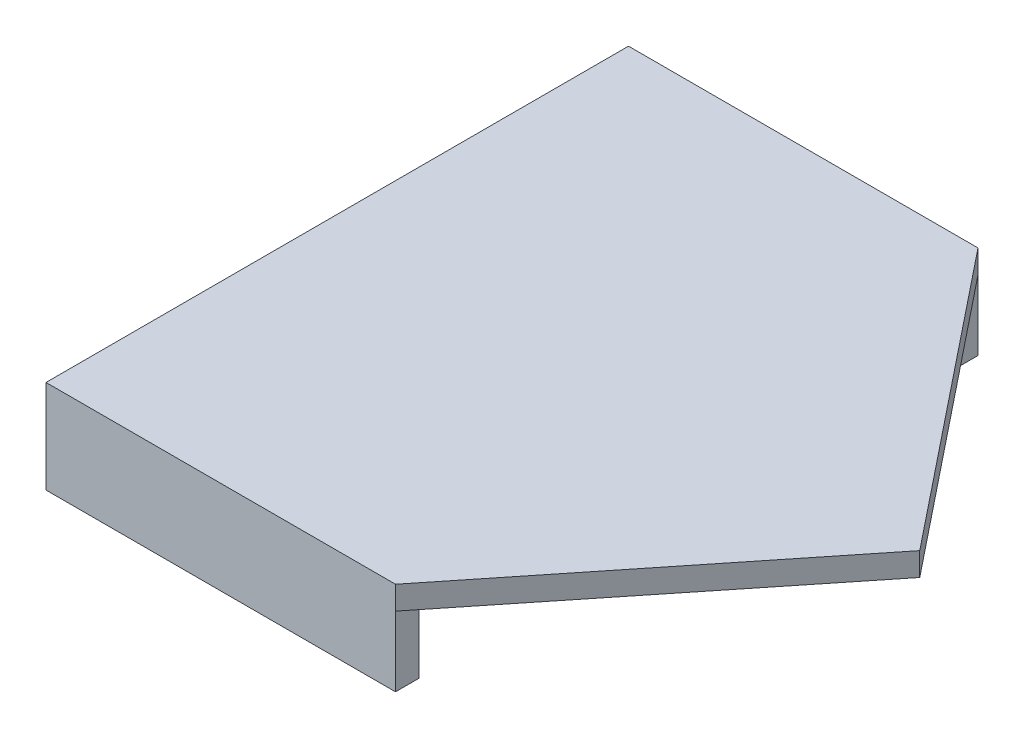
ISO-10303-21;
HEADER;
FILE_DESCRIPTION(('STEP AP214'),'2;1');
FILE_NAME('part.step','',(''),(''),'','','');
FILE_SCHEMA(('AUTOMOTIVE_DESIGN { 1 0 10303 214 1 1 1 1 }'));
ENDSEC;
DATA;
#1=APPLICATION_CONTEXT('core data for automotive mechanical design processes');
#2=APPLICATION_PROTOCOL_DEFINITION('international standard','automotive_design',2000,#1);
#3=PRODUCT_CONTEXT('',#1,'mechanical');
#4=PRODUCT('Part','Part','',(#3));
#5=PRODUCT_RELATED_PRODUCT_CATEGORY('part','',(#4));
#6=PRODUCT_DEFINITION_FORMATION('','',#4);
#7=PRODUCT_DEFINITION_CONTEXT('part definition',#1,'design');
#8=PRODUCT_DEFINITION('design','',#6,#7);
#9=PRODUCT_DEFINITION_SHAPE('','',#8);
#10=(LENGTH_UNIT() NAMED_UNIT(*) SI_UNIT(.MILLI.,.METRE.));
#11=(NAMED_UNIT(*) PLANE_ANGLE_UNIT() SI_UNIT($,.RADIAN.));
#12=(NAMED_UNIT(*) SI_UNIT($,.STERADIAN.) SOLID_ANGLE_UNIT());
#13=UNCERTAINTY_MEASURE_WITH_UNIT(LENGTH_MEASURE(1.E-05),#10,'distance_accuracy_value','');
#14=(GEOMETRIC_REPRESENTATION_CONTEXT(3) GLOBAL_UNCERTAINTY_ASSIGNED_CONTEXT((#13)) GLOBAL_UNIT_ASSIGNED_CONTEXT((#10,
#11,#12)) REPRESENTATION_CONTEXT('',''));
#15=CARTESIAN_POINT('',(0.,0.,0.));
#16=DIRECTION('',(0.,0.,1.));
#17=DIRECTION('',(1.,0.,0.));
#18=AXIS2_PLACEMENT_3D('',#15,#16,#17);
#19=CARTESIAN_POINT('',(0.,-5.,0.));
#20=DIRECTION('',(0.,1.,0.));
#21=DIRECTION('',(0.,0.,1.));
#22=AXIS2_PLACEMENT_3D('',#19,#20,#21);
#23=PLANE('',#22);
#24=DIRECTION('',(0.,0.,1.));
#25=VECTOR('',#24,1.);
#26=CARTESIAN_POINT('',(75.,-5.,115.));
#27=LINE('',#26,#25);
#28=CARTESIAN_POINT('',(75.,-5.,115.));
#29=VERTEX_POINT('',#28);
#30=CARTESIAN_POINT('',(75.,-5.,125.));
#31=VERTEX_POINT('',#30);
#32=EDGE_CURVE('E142',#29,#31,#27,.T.);
#33=ORIENTED_EDGE('',*,*,#32,.F.);
#34=DIRECTION('',(1.,0.,0.));
#35=VECTOR('',#34,1.);
#36=CARTESIAN_POINT('',(75.,-5.,115.));
#37=LINE('',#36,#35);
#38=CARTESIAN_POINT('',(-75.,-5.,115.));
#39=VERTEX_POINT('',#38);
#40=EDGE_CURVE('E212',#39,#29,#37,.T.);
#41=ORIENTED_EDGE('',*,*,#40,.F.);
#42=DIRECTION('',(0.,0.,1.));
#43=VECTOR('',#42,1.);
#44=CARTESIAN_POINT('',(-75.,-5.,125.));
#45=LINE('',#44,#43);
#46=CARTESIAN_POINT('',(-75.,-5.,-115.));
#47=VERTEX_POINT('',#46);
#48=EDGE_CURVE('E110',#47,#39,#45,.T.);
#49=ORIENTED_EDGE('',*,*,#48,.F.);
#50=DIRECTION('',(1.,0.,0.));
#51=VECTOR('',#50,1.);
#52=CARTESIAN_POINT('',(75.,-5.,-115.));
#53=LINE('',#52,#51);
#54=CARTESIAN_POINT('',(75.,-5.,-115.));
#55=VERTEX_POINT('',#54);
#56=EDGE_CURVE('E158',#47,#55,#53,.T.);
#57=ORIENTED_EDGE('',*,*,#56,.T.);
#58=DIRECTION('',(0.,0.,-1.));
#59=VECTOR('',#58,1.);
#60=CARTESIAN_POINT('',(75.,-5.,-115.));
#61=LINE('',#60,#59);
#62=CARTESIAN_POINT('',(75.,-5.,-125.));
#63=VERTEX_POINT('',#62);
#64=EDGE_CURVE('E113',#55,#63,#61,.T.);
#65=ORIENTED_EDGE('',*,*,#64,.T.);
#66=DIRECTION('',(-0.624695047554424,0.,-0.78086880944303));
#67=VECTOR('',#66,1.);
#68=CARTESIAN_POINT('',(75.,-5.,-125.));
#69=LINE('',#68,#67);
#70=CARTESIAN_POINT('',(175.,-5.,0.));
#71=VERTEX_POINT('',#70);
#72=EDGE_CURVE('E115',#71,#63,#69,.T.);
#73=ORIENTED_EDGE('',*,*,#72,.F.);
#74=DIRECTION('',(0.624695047554425,0.,-0.78086880944303));
#75=VECTOR('',#74,1.);
#76=CARTESIAN_POINT('',(175.,-5.,0.));
#77=LINE('',#76,#75);
#78=EDGE_CURVE('E65',#31,#71,#77,.T.);
#79=ORIENTED_EDGE('',*,*,#78,.F.);
#80=EDGE_LOOP('',(#33,#41,#49,#57,#65,#73,#79));
#81=FACE_BOUND('',#80,.T.);
#82=ADVANCED_FACE('F33',(#81),#23,.F.);
#83=CARTESIAN_POINT('',(-75.,5.,-125.));
#84=DIRECTION('',(0.,0.,1.));
#85=DIRECTION('',(1.,0.,0.));
#86=AXIS2_PLACEMENT_3D('',#83,#84,#85);
#87=PLANE('',#86);
#88=DIRECTION('',(0.,-1.,0.));
#89=VECTOR('',#88,1.);
#90=CARTESIAN_POINT('',(75.,5.,-125.));
#91=LINE('',#90,#89);
#92=CARTESIAN_POINT('',(75.,5.,-125.));
#93=VERTEX_POINT('',#92);
#94=EDGE_CURVE('E106',#93,#63,#91,.T.);
#95=ORIENTED_EDGE('',*,*,#94,.T.);
#96=DIRECTION('',(0.,-1.,0.));
#97=VECTOR('',#96,1.);
#98=CARTESIAN_POINT('',(75.,-35.,-125.));
#99=LINE('',#98,#97);
#100=CARTESIAN_POINT('',(75.,-35.,-125.));
#101=VERTEX_POINT('',#100);
#102=EDGE_CURVE('E73',#63,#101,#99,.T.);
#103=ORIENTED_EDGE('',*,*,#102,.T.);
#104=DIRECTION('',(-1.,0.,0.));
#105=VECTOR('',#104,1.);
#106=CARTESIAN_POINT('',(-75.,-35.,-125.));
#107=LINE('',#106,#105);
#108=CARTESIAN_POINT('',(-75.,-35.,-125.));
#109=VERTEX_POINT('',#108);
#110=EDGE_CURVE('E152',#101,#109,#107,.T.);
#111=ORIENTED_EDGE('',*,*,#110,.T.);
#112=DIRECTION('',(0.,-1.,0.));
#113=VECTOR('',#112,1.);
#114=CARTESIAN_POINT('',(-75.,5.,-125.));
#115=LINE('',#114,#113);
#116=CARTESIAN_POINT('',(-75.,5.,-125.));
#117=VERTEX_POINT('',#116);
#118=EDGE_CURVE('E11',#117,#109,#115,.T.);
#119=ORIENTED_EDGE('',*,*,#118,.F.);
#120=DIRECTION('',(-1.,0.,0.));
#121=VECTOR('',#120,1.);
#122=CARTESIAN_POINT('',(-75.,5.,-125.));
#123=LINE('',#122,#121);
#124=EDGE_CURVE('E118',#93,#117,#123,.T.);
#125=ORIENTED_EDGE('',*,*,#124,.F.);
#126=EDGE_LOOP('',(#95,#103,#111,#119,#125));
#127=FACE_BOUND('',#126,.T.);
#128=ADVANCED_FACE('F35',(#127),#87,.F.);
#129=CARTESIAN_POINT('',(-75.,5.,125.));
#130=DIRECTION('',(1.,0.,0.));
#131=DIRECTION('',(0.,0.,-1.));
#132=AXIS2_PLACEMENT_3D('',#129,#130,#131);
#133=PLANE('',#132);
#134=ORIENTED_EDGE('',*,*,#118,.T.);
#135=DIRECTION('',(0.,0.,-1.));
#136=VECTOR('',#135,1.);
#137=CARTESIAN_POINT('',(-75.,-35.,-115.));
#138=LINE('',#137,#136);
#139=CARTESIAN_POINT('',(-75.,-35.,-115.));
#140=VERTEX_POINT('',#139);
#141=EDGE_CURVE('E166',#140,#109,#138,.T.);
#142=ORIENTED_EDGE('',*,*,#141,.F.);
#143=DIRECTION('',(0.,1.,0.));
#144=VECTOR('',#143,1.);
#145=CARTESIAN_POINT('',(-75.,-5.,-115.));
#146=LINE('',#145,#144);
#147=EDGE_CURVE('E155',#140,#47,#146,.T.);
#148=ORIENTED_EDGE('',*,*,#147,.T.);
#149=ORIENTED_EDGE('',*,*,#48,.T.);
#150=DIRECTION('',(0.,1.,0.));
#151=VECTOR('',#150,1.);
#152=CARTESIAN_POINT('',(-75.,-5.,115.));
#153=LINE('',#152,#151);
#154=CARTESIAN_POINT('',(-75.,-35.,115.));
#155=VERTEX_POINT('',#154);
#156=EDGE_CURVE('E141',#155,#39,#153,.T.);
#157=ORIENTED_EDGE('',*,*,#156,.F.);
#158=DIRECTION('',(0.,0.,1.));
#159=VECTOR('',#158,1.);
#160=CARTESIAN_POINT('',(-75.,-35.,115.));
#161=LINE('',#160,#159);
#162=CARTESIAN_POINT('',(-75.,-35.,125.));
#163=VERTEX_POINT('',#162);
#164=EDGE_CURVE('E133',#155,#163,#161,.T.);
#165=ORIENTED_EDGE('',*,*,#164,.T.);
#166=DIRECTION('',(0.,-1.,0.));
#167=VECTOR('',#166,1.);
#168=CARTESIAN_POINT('',(-75.,5.,125.));
#169=LINE('',#168,#167);
#170=CARTESIAN_POINT('',(-75.,5.,125.));
#171=VERTEX_POINT('',#170);
#172=EDGE_CURVE('E42',#171,#163,#169,.T.);
#173=ORIENTED_EDGE('',*,*,#172,.F.);
#174=DIRECTION('',(0.,0.,1.));
#175=VECTOR('',#174,1.);
#176=CARTESIAN_POINT('',(-75.,5.,125.));
#177=LINE('',#176,#175);
#178=EDGE_CURVE('E81',#117,#171,#177,.T.);
#179=ORIENTED_EDGE('',*,*,#178,.F.);
#180=EDGE_LOOP('',(#134,#142,#148,#149,#157,#165,#173,#179));
#181=FACE_BOUND('',#180,.T.);
#182=ADVANCED_FACE('F139',(#181),#133,.F.);
#183=CARTESIAN_POINT('',(-75.,5.,125.));
#184=DIRECTION('',(0.,0.,-1.));
#185=DIRECTION('',(-1.,0.,0.));
#186=AXIS2_PLACEMENT_3D('',#183,#184,#185);
#187=PLANE('',#186);
#188=ORIENTED_EDGE('',*,*,#172,.T.);
#189=DIRECTION('',(-1.,0.,0.));
#190=VECTOR('',#189,1.);
#191=CARTESIAN_POINT('',(-75.,-35.,125.));
#192=LINE('',#191,#190);
#193=CARTESIAN_POINT('',(75.,-35.,125.));
#194=VERTEX_POINT('',#193);
#195=EDGE_CURVE('E124',#194,#163,#192,.T.);
#196=ORIENTED_EDGE('',*,*,#195,.F.);
#197=DIRECTION('',(0.,-1.,0.));
#198=VECTOR('',#197,1.);
#199=CARTESIAN_POINT('',(75.,-35.,125.));
#200=LINE('',#199,#198);
#201=EDGE_CURVE('E100',#31,#194,#200,.T.);
#202=ORIENTED_EDGE('',*,*,#201,.F.);
#203=DIRECTION('',(0.,-1.,0.));
#204=VECTOR('',#203,1.);
#205=CARTESIAN_POINT('',(75.,5.,125.));
#206=LINE('',#205,#204);
#207=CARTESIAN_POINT('',(75.,5.,125.));
#208=VERTEX_POINT('',#207);
#209=EDGE_CURVE('E96',#208,#31,#206,.T.);
#210=ORIENTED_EDGE('',*,*,#209,.F.);
#211=DIRECTION('',(1.,0.,0.));
#212=VECTOR('',#211,1.);
#213=CARTESIAN_POINT('',(-75.,5.,125.));
#214=LINE('',#213,#212);
#215=EDGE_CURVE('E88',#171,#208,#214,.T.);
#216=ORIENTED_EDGE('',*,*,#215,.F.);
#217=EDGE_LOOP('',(#188,#196,#202,#210,#216));
#218=FACE_BOUND('',#217,.T.);
#219=ADVANCED_FACE('F97',(#218),#187,.F.);
#220=CARTESIAN_POINT('',(175.,5.,0.));
#221=DIRECTION('',(-0.78086880944303,0.,-0.624695047554425));
#222=DIRECTION('',(-0.624695047554425,0.,0.78086880944303));
#223=AXIS2_PLACEMENT_3D('',#220,#221,#222);
#224=PLANE('',#223);
#225=ORIENTED_EDGE('',*,*,#78,.T.);
#226=DIRECTION('',(0.,-1.,0.));
#227=VECTOR('',#226,1.);
#228=CARTESIAN_POINT('',(175.,5.,0.));
#229=LINE('',#228,#227);
#230=CARTESIAN_POINT('',(175.,5.,0.));
#231=VERTEX_POINT('',#230);
#232=EDGE_CURVE('E102',#231,#71,#229,.T.);
#233=ORIENTED_EDGE('',*,*,#232,.F.);
#234=DIRECTION('',(0.624695047554425,0.,-0.78086880944303));
#235=VECTOR('',#234,1.);
#236=CARTESIAN_POINT('',(175.,5.,0.));
#237=LINE('',#236,#235);
#238=EDGE_CURVE('E92',#208,#231,#237,.T.);
#239=ORIENTED_EDGE('',*,*,#238,.F.);
#240=ORIENTED_EDGE('',*,*,#209,.T.);
#241=EDGE_LOOP('',(#225,#233,#239,#240));
#242=FACE_BOUND('',#241,.T.);
#243=ADVANCED_FACE('F104',(#242),#224,.F.);
#244=CARTESIAN_POINT('',(75.,5.,-125.));
#245=DIRECTION('',(-0.78086880944303,0.,0.624695047554424));
#246=DIRECTION('',(0.624695047554424,0.,0.78086880944303));
#247=AXIS2_PLACEMENT_3D('',#244,#245,#246);
#248=PLANE('',#247);
#249=ORIENTED_EDGE('',*,*,#72,.T.);
#250=ORIENTED_EDGE('',*,*,#94,.F.);
#251=DIRECTION('',(-0.624695047554424,0.,-0.78086880944303));
#252=VECTOR('',#251,1.);
#253=CARTESIAN_POINT('',(75.,5.,-125.));
#254=LINE('',#253,#252);
#255=EDGE_CURVE('E50',#231,#93,#254,.T.);
#256=ORIENTED_EDGE('',*,*,#255,.F.);
#257=ORIENTED_EDGE('',*,*,#232,.T.);
#258=EDGE_LOOP('',(#249,#250,#256,#257));
#259=FACE_BOUND('',#258,.T.);
#260=ADVANCED_FACE('F197',(#259),#248,.F.);
#261=CARTESIAN_POINT('',(0.,5.,0.));
#262=DIRECTION('',(0.,1.,0.));
#263=DIRECTION('',(0.,0.,1.));
#264=AXIS2_PLACEMENT_3D('',#261,#262,#263);
#265=PLANE('',#264);
#266=ORIENTED_EDGE('',*,*,#124,.T.);
#267=ORIENTED_EDGE('',*,*,#178,.T.);
#268=ORIENTED_EDGE('',*,*,#215,.T.);
#269=ORIENTED_EDGE('',*,*,#238,.T.);
#270=ORIENTED_EDGE('',*,*,#255,.T.);
#271=EDGE_LOOP('',(#266,#267,#268,#269,#270));
#272=FACE_BOUND('',#271,.T.);
#273=ADVANCED_FACE('F90',(#272),#265,.T.);
#274=CARTESIAN_POINT('',(75.,-35.,-115.));
#275=DIRECTION('',(1.,0.,0.));
#276=DIRECTION('',(0.,0.,-1.));
#277=AXIS2_PLACEMENT_3D('',#274,#275,#276);
#278=PLANE('',#277);
#279=ORIENTED_EDGE('',*,*,#102,.F.);
#280=ORIENTED_EDGE('',*,*,#64,.F.);
#281=DIRECTION('',(0.,-1.,0.));
#282=VECTOR('',#281,1.);
#283=CARTESIAN_POINT('',(75.,-35.,-115.));
#284=LINE('',#283,#282);
#285=CARTESIAN_POINT('',(75.,-35.,-115.));
#286=VERTEX_POINT('',#285);
#287=EDGE_CURVE('E148',#55,#286,#284,.T.);
#288=ORIENTED_EDGE('',*,*,#287,.T.);
#289=DIRECTION('',(0.,0.,-1.));
#290=VECTOR('',#289,1.);
#291=CARTESIAN_POINT('',(75.,-35.,-115.));
#292=LINE('',#291,#290);
#293=EDGE_CURVE('E161',#286,#101,#292,.T.);
#294=ORIENTED_EDGE('',*,*,#293,.T.);
#295=EDGE_LOOP('',(#279,#280,#288,#294));
#296=FACE_BOUND('',#295,.T.);
#297=ADVANCED_FACE('F190',(#296),#278,.T.);
#298=CARTESIAN_POINT('',(-75.,-35.,-115.));
#299=DIRECTION('',(0.,-1.,0.));
#300=DIRECTION('',(1.,0.,0.));
#301=AXIS2_PLACEMENT_3D('',#298,#299,#300);
#302=PLANE('',#301);
#303=ORIENTED_EDGE('',*,*,#110,.F.);
#304=ORIENTED_EDGE('',*,*,#293,.F.);
#305=DIRECTION('',(-1.,0.,0.));
#306=VECTOR('',#305,1.);
#307=CARTESIAN_POINT('',(-75.,-35.,-115.));
#308=LINE('',#307,#306);
#309=EDGE_CURVE('E151',#286,#140,#308,.T.);
#310=ORIENTED_EDGE('',*,*,#309,.T.);
#311=ORIENTED_EDGE('',*,*,#141,.T.);
#312=EDGE_LOOP('',(#303,#304,#310,#311));
#313=FACE_BOUND('',#312,.T.);
#314=ADVANCED_FACE('F180',(#313),#302,.T.);
#315=CARTESIAN_POINT('',(0.,0.,-115.));
#316=DIRECTION('',(0.,0.,1.));
#317=DIRECTION('',(1.,0.,0.));
#318=AXIS2_PLACEMENT_3D('',#315,#316,#317);
#319=PLANE('',#318);
#320=ORIENTED_EDGE('',*,*,#287,.F.);
#321=ORIENTED_EDGE('',*,*,#56,.F.);
#322=ORIENTED_EDGE('',*,*,#147,.F.);
#323=ORIENTED_EDGE('',*,*,#309,.F.);
#324=EDGE_LOOP('',(#320,#321,#322,#323));
#325=FACE_BOUND('',#324,.T.);
#326=ADVANCED_FACE('F187',(#325),#319,.T.);
#327=CARTESIAN_POINT('',(75.,-35.,115.));
#328=DIRECTION('',(-1.,0.,0.));
#329=DIRECTION('',(0.,0.,1.));
#330=AXIS2_PLACEMENT_3D('',#327,#328,#329);
#331=PLANE('',#330);
#332=ORIENTED_EDGE('',*,*,#201,.T.);
#333=DIRECTION('',(0.,0.,1.));
#334=VECTOR('',#333,1.);
#335=CARTESIAN_POINT('',(75.,-35.,115.));
#336=LINE('',#335,#334);
#337=CARTESIAN_POINT('',(75.,-35.,115.));
#338=VERTEX_POINT('',#337);
#339=EDGE_CURVE('E136',#338,#194,#336,.T.);
#340=ORIENTED_EDGE('',*,*,#339,.F.);
#341=DIRECTION('',(0.,-1.,0.));
#342=VECTOR('',#341,1.);
#343=CARTESIAN_POINT('',(75.,-35.,115.));
#344=LINE('',#343,#342);
#345=EDGE_CURVE('E137',#29,#338,#344,.T.);
#346=ORIENTED_EDGE('',*,*,#345,.F.);
#347=ORIENTED_EDGE('',*,*,#32,.T.);
#348=EDGE_LOOP('',(#332,#340,#346,#347));
#349=FACE_BOUND('',#348,.T.);
#350=ADVANCED_FACE('F217',(#349),#331,.F.);
#351=CARTESIAN_POINT('',(-75.,-35.,115.));
#352=DIRECTION('',(0.,1.,0.));
#353=DIRECTION('',(-1.,0.,0.));
#354=AXIS2_PLACEMENT_3D('',#351,#352,#353);
#355=PLANE('',#354);
#356=ORIENTED_EDGE('',*,*,#195,.T.);
#357=ORIENTED_EDGE('',*,*,#164,.F.);
#358=DIRECTION('',(-1.,0.,0.));
#359=VECTOR('',#358,1.);
#360=CARTESIAN_POINT('',(-75.,-35.,115.));
#361=LINE('',#360,#359);
#362=EDGE_CURVE('E145',#338,#155,#361,.T.);
#363=ORIENTED_EDGE('',*,*,#362,.F.);
#364=ORIENTED_EDGE('',*,*,#339,.T.);
#365=EDGE_LOOP('',(#356,#357,#363,#364));
#366=FACE_BOUND('',#365,.T.);
#367=ADVANCED_FACE('F130',(#366),#355,.F.);
#368=CARTESIAN_POINT('',(0.,0.,115.));
#369=DIRECTION('',(0.,0.,-1.));
#370=DIRECTION('',(1.,0.,0.));
#371=AXIS2_PLACEMENT_3D('',#368,#369,#370);
#372=PLANE('',#371);
#373=ORIENTED_EDGE('',*,*,#345,.T.);
#374=ORIENTED_EDGE('',*,*,#362,.T.);
#375=ORIENTED_EDGE('',*,*,#156,.T.);
#376=ORIENTED_EDGE('',*,*,#40,.T.);
#377=EDGE_LOOP('',(#373,#374,#375,#376));
#378=FACE_BOUND('',#377,.T.);
#379=ADVANCED_FACE('F214',(#378),#372,.T.);
#380=CLOSED_SHELL('',(#82,#128,#182,#219,#243,#260,#273,#297,#314,#326,#350,#367,#379));
#381=MANIFOLD_SOLID_BREP('B2',#380);
#382=ADVANCED_BREP_SHAPE_REPRESENTATION('',(#18,#381),#14);
#383=SHAPE_DEFINITION_REPRESENTATION(#9,#382);
ENDSEC;
END-ISO-10303-21;
